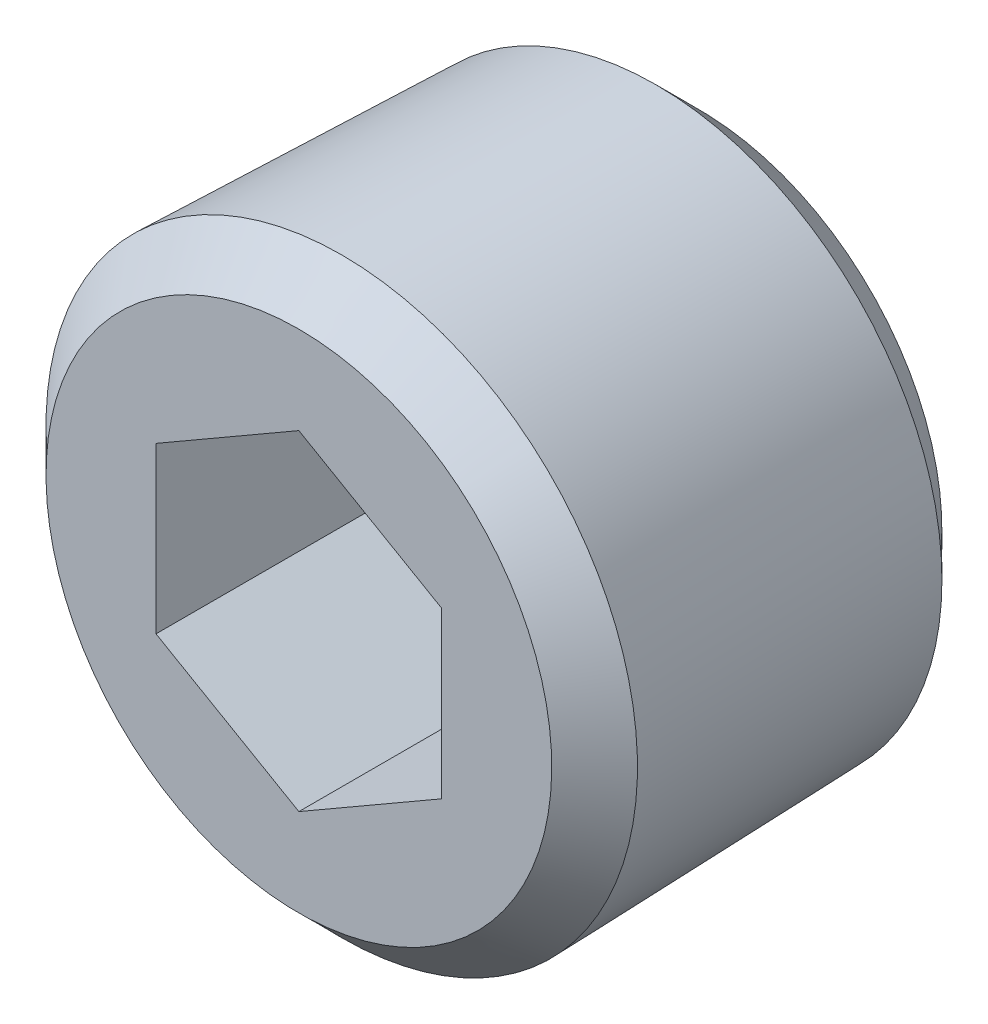
ISO-10303-21;
HEADER;
FILE_DESCRIPTION(('STEP AP214'),'2;1');
FILE_NAME('part.step','',(''),(''),'','','');
FILE_SCHEMA(('AUTOMOTIVE_DESIGN { 1 0 10303 214 1 1 1 1 }'));
ENDSEC;
DATA;
#1=APPLICATION_CONTEXT('core data for automotive mechanical design processes');
#2=APPLICATION_PROTOCOL_DEFINITION('international standard','automotive_design',2000,#1);
#3=PRODUCT_CONTEXT('',#1,'mechanical');
#4=PRODUCT('Part','Part','',(#3));
#5=PRODUCT_RELATED_PRODUCT_CATEGORY('part','',(#4));
#6=PRODUCT_DEFINITION_FORMATION('','',#4);
#7=PRODUCT_DEFINITION_CONTEXT('part definition',#1,'design');
#8=PRODUCT_DEFINITION('design','',#6,#7);
#9=PRODUCT_DEFINITION_SHAPE('','',#8);
#10=(LENGTH_UNIT() NAMED_UNIT(*) SI_UNIT(.MILLI.,.METRE.));
#11=(NAMED_UNIT(*) PLANE_ANGLE_UNIT() SI_UNIT($,.RADIAN.));
#12=(NAMED_UNIT(*) SI_UNIT($,.STERADIAN.) SOLID_ANGLE_UNIT());
#13=UNCERTAINTY_MEASURE_WITH_UNIT(LENGTH_MEASURE(1.E-05),#10,'distance_accuracy_value','');
#14=(GEOMETRIC_REPRESENTATION_CONTEXT(3) GLOBAL_UNCERTAINTY_ASSIGNED_CONTEXT((#13)) GLOBAL_UNIT_ASSIGNED_CONTEXT((#10,
#11,#12)) REPRESENTATION_CONTEXT('',''));
#15=CARTESIAN_POINT('',(0.,0.,0.));
#16=DIRECTION('',(0.,0.,1.));
#17=DIRECTION('',(1.,0.,0.));
#18=AXIS2_PLACEMENT_3D('',#15,#16,#17);
#19=CARTESIAN_POINT('',(0.,8.84999999999991,13.9999999999999));
#20=DIRECTION('',(0.,0.,0.999999999999999));
#21=DIRECTION('',(0.,-1.,0.));
#22=AXIS2_PLACEMENT_3D('',#19,#20,#21);
#23=PLANE('',#22);
#24=DIRECTION('',(0.866025403784439,-0.5,0.));
#25=VECTOR('',#24,1.);
#26=CARTESIAN_POINT('',(-5.00000000000009,-2.8867513459482,14.0000000000002));
#27=LINE('',#26,#25);
#28=CARTESIAN_POINT('',(-5.00000000000009,-2.8867513459482,14.0000000000002));
#29=VERTEX_POINT('',#28);
#30=CARTESIAN_POINT('',(-1.11022302462516E-13,-5.77350269189647,13.9999999999999));
#31=VERTEX_POINT('',#30);
#32=EDGE_CURVE('E57',#29,#31,#27,.T.);
#33=ORIENTED_EDGE('',*,*,#32,.F.);
#34=DIRECTION('',(0.,-1.,0.));
#35=VECTOR('',#34,1.);
#36=CARTESIAN_POINT('',(-5.00000000000011,2.88675134594806,14.));
#37=LINE('',#36,#35);
#38=CARTESIAN_POINT('',(-5.00000000000011,2.88675134594806,14.));
#39=VERTEX_POINT('',#38);
#40=EDGE_CURVE('E140',#39,#29,#37,.T.);
#41=ORIENTED_EDGE('',*,*,#40,.F.);
#42=DIRECTION('',(-0.866025403784437,-0.500000000000001,0.));
#43=VECTOR('',#42,1.);
#44=CARTESIAN_POINT('',(-1.04083408558608E-13,5.77350269189636,14.));
#45=LINE('',#44,#43);
#46=CARTESIAN_POINT('',(-1.04083408558608E-13,5.77350269189636,14.));
#47=VERTEX_POINT('',#46);
#48=EDGE_CURVE('E138',#47,#39,#45,.T.);
#49=ORIENTED_EDGE('',*,*,#48,.F.);
#50=DIRECTION('',(-0.866025403784439,0.5,0.));
#51=VECTOR('',#50,1.);
#52=CARTESIAN_POINT('',(4.99999999999993,2.88675134594805,13.9999999999999));
#53=LINE('',#52,#51);
#54=CARTESIAN_POINT('',(4.99999999999993,2.88675134594805,13.9999999999999));
#55=VERTEX_POINT('',#54);
#56=EDGE_CURVE('E105',#55,#47,#53,.T.);
#57=ORIENTED_EDGE('',*,*,#56,.F.);
#58=DIRECTION('',(0.,1.,0.));
#59=VECTOR('',#58,1.);
#60=CARTESIAN_POINT('',(4.99999999999991,-2.8867513459482,13.9999999999998));
#61=LINE('',#60,#59);
#62=CARTESIAN_POINT('',(4.99999999999991,-2.8867513459482,13.9999999999998));
#63=VERTEX_POINT('',#62);
#64=EDGE_CURVE('E134',#63,#55,#61,.T.);
#65=ORIENTED_EDGE('',*,*,#64,.F.);
#66=DIRECTION('',(0.866025403784436,0.500000000000001,0.));
#67=VECTOR('',#66,1.);
#68=CARTESIAN_POINT('',(-1.11022302462516E-13,-5.77350269189647,13.9999999999999));
#69=LINE('',#68,#67);
#70=EDGE_CURVE('E131',#31,#63,#69,.T.);
#71=ORIENTED_EDGE('',*,*,#70,.F.);
#72=EDGE_LOOP('',(#33,#41,#49,#57,#65,#71));
#73=FACE_BOUND('',#72,.T.);
#74=CARTESIAN_POINT('',(0.,-1.14491749414469E-13,13.9999999999999));
#75=DIRECTION('',(0.,0.,-0.999999999999999));
#76=DIRECTION('',(0.,1.,0.));
#77=AXIS2_PLACEMENT_3D('',#74,#75,#76);
#78=CIRCLE('',#77,8.85);
#79=CARTESIAN_POINT('',(0.,8.85000000000013,13.9999999999999));
#80=VERTEX_POINT('',#79);
#81=EDGE_CURVE('E11',#80,#80,#78,.T.);
#82=ORIENTED_EDGE('',*,*,#81,.F.);
#83=EDGE_LOOP('',(#82));
#84=FACE_BOUND('',#83,.T.);
#85=ADVANCED_FACE('F43',(#73,#84),#23,.T.);
#86=CARTESIAN_POINT('',(0.,0.,12.5));
#87=DIRECTION('',(0.,0.,-0.999999999999999));
#88=DIRECTION('',(0.,1.,0.));
#89=AXIS2_PLACEMENT_3D('',#86,#87,#88);
#90=CONICAL_SURFACE('',#89,10.35,0.785398163397447);
#91=CARTESIAN_POINT('',(0.,0.,12.5));
#92=DIRECTION('',(0.,0.,-0.999999999999999));
#93=DIRECTION('',(0.,1.,0.));
#94=AXIS2_PLACEMENT_3D('',#91,#92,#93);
#95=CIRCLE('',#94,10.35);
#96=CARTESIAN_POINT('',(0.,10.35,12.5));
#97=VERTEX_POINT('',#96);
#98=EDGE_CURVE('E50',#97,#97,#95,.T.);
#99=CARTESIAN_POINT('',(0.,8.85000000000013,13.9999999999999));
#100=CARTESIAN_POINT('',(0.,8.86562500000013,13.9843749999999));
#101=CARTESIAN_POINT('',(0.,8.88125000000013,13.9687499999999));
#102=CARTESIAN_POINT('',(0.,8.91250000000013,13.9374999999999));
#103=CARTESIAN_POINT('',(0.,8.92812500000013,13.9218749999999));
#104=CARTESIAN_POINT('',(0.,8.95937500000012,13.8906249999999));
#105=CARTESIAN_POINT('',(0.,8.97500000000012,13.8749999999999));
#106=CARTESIAN_POINT('',(0.,9.00625000000012,13.8437499999999));
#107=CARTESIAN_POINT('',(0.,9.02187500000012,13.8281249999999));
#108=CARTESIAN_POINT('',(0.,9.05312500000012,13.7968749999999));
#109=CARTESIAN_POINT('',(0.,9.06875000000011,13.7812499999999));
#110=CARTESIAN_POINT('',(0.,9.10000000000011,13.7499999999999));
#111=CARTESIAN_POINT('',(0.,9.11562500000011,13.7343749999999));
#112=CARTESIAN_POINT('',(0.,9.1468750000001,13.7031249999999));
#113=CARTESIAN_POINT('',(0.,9.1625000000001,13.6874999999999));
#114=CARTESIAN_POINT('',(0.,9.1937500000001,13.6562499999999));
#115=CARTESIAN_POINT('',(0.,9.2093750000001,13.6406249999999));
#116=CARTESIAN_POINT('',(0.,9.2406250000001,13.6093749999999));
#117=CARTESIAN_POINT('',(0.,9.2562500000001,13.5937499999999));
#118=CARTESIAN_POINT('',(0.,9.28750000000009,13.5624999999999));
#119=CARTESIAN_POINT('',(0.,9.30312500000009,13.5468749999999));
#120=CARTESIAN_POINT('',(0.,9.33437500000009,13.5156249999999));
#121=CARTESIAN_POINT('',(0.,9.35000000000009,13.4999999999999));
#122=CARTESIAN_POINT('',(0.,9.38125000000008,13.4687499999999));
#123=CARTESIAN_POINT('',(0.,9.39687500000008,13.4531249999999));
#124=CARTESIAN_POINT('',(0.,9.42812500000008,13.4218749999999));
#125=CARTESIAN_POINT('',(0.,9.44375000000008,13.4062499999999));
#126=CARTESIAN_POINT('',(0.,9.47500000000007,13.3749999999999));
#127=CARTESIAN_POINT('',(0.,9.49062500000007,13.3593749999999));
#128=CARTESIAN_POINT('',(0.,9.52187500000007,13.3281249999999));
#129=CARTESIAN_POINT('',(0.,9.53750000000007,13.3124999999999));
#130=CARTESIAN_POINT('',(0.,9.56875000000007,13.2812499999999));
#131=CARTESIAN_POINT('',(0.,9.58437500000007,13.2656249999999));
#132=CARTESIAN_POINT('',(0.,9.61562500000006,13.2343749999999));
#133=CARTESIAN_POINT('',(0.,9.63125000000006,13.2187499999999));
#134=CARTESIAN_POINT('',(0.,9.66250000000006,13.1875));
#135=CARTESIAN_POINT('',(0.,9.67812500000006,13.171875));
#136=CARTESIAN_POINT('',(0.,9.70937500000005,13.140625));
#137=CARTESIAN_POINT('',(0.,9.72500000000005,13.125));
#138=CARTESIAN_POINT('',(0.,9.75625000000005,13.09375));
#139=CARTESIAN_POINT('',(0.,9.77187500000005,13.078125));
#140=CARTESIAN_POINT('',(0.,9.80312500000004,13.046875));
#141=CARTESIAN_POINT('',(0.,9.81875000000004,13.03125));
#142=CARTESIAN_POINT('',(0.,9.85000000000004,13.));
#143=CARTESIAN_POINT('',(0.,9.86562500000004,12.984375));
#144=CARTESIAN_POINT('',(0.,9.89687500000003,12.953125));
#145=CARTESIAN_POINT('',(0.,9.91250000000003,12.9375));
#146=CARTESIAN_POINT('',(0.,9.94375000000003,12.90625));
#147=CARTESIAN_POINT('',(0.,9.95937500000003,12.890625));
#148=CARTESIAN_POINT('',(0.,9.99062500000003,12.859375));
#149=CARTESIAN_POINT('',(0.,10.00625,12.84375));
#150=CARTESIAN_POINT('',(0.,10.0375,12.8125));
#151=CARTESIAN_POINT('',(0.,10.053125,12.796875));
#152=CARTESIAN_POINT('',(0.,10.084375,12.765625));
#153=CARTESIAN_POINT('',(0.,10.1,12.75));
#154=CARTESIAN_POINT('',(0.,10.13125,12.71875));
#155=CARTESIAN_POINT('',(0.,10.146875,12.703125));
#156=CARTESIAN_POINT('',(0.,10.178125,12.671875));
#157=CARTESIAN_POINT('',(0.,10.19375,12.65625));
#158=CARTESIAN_POINT('',(0.,10.225,12.625));
#159=CARTESIAN_POINT('',(0.,10.240625,12.609375));
#160=CARTESIAN_POINT('',(0.,10.271875,12.578125));
#161=CARTESIAN_POINT('',(0.,10.2875,12.5625));
#162=CARTESIAN_POINT('',(0.,10.31875,12.53125));
#163=CARTESIAN_POINT('',(0.,10.334375,12.515625));
#164=CARTESIAN_POINT('',(0.,10.35,12.5));
#165=B_SPLINE_CURVE_WITH_KNOTS('',3,(#99,#100,#101,#102,#103,#104,#105,#106,#107,#108,#109,#110,
#111,#112,#113,#114,#115,#116,#117,#118,#119,#120,#121,#122,#123,#124,#125,#126,#127,#128,#129,
#130,#131,#132,#133,#134,#135,#136,#137,#138,#139,#140,#141,#142,#143,#144,#145,#146,#147,#148,
#149,#150,#151,#152,#153,#154,#155,#156,#157,#158,#159,#160,#161,#162,#163,#164),.UNSPECIFIED.,
.F.,.F.,(4,2,2,2,2,2,2,2,2,2,2,2,2,2,2,2,2,2,2,2,2,2,2,2,2,2,2,2,2,2,2,2,4),(0.,
0.0662912607362328,0.132582521472467,0.198873782208698,0.265165042944931,0.331456303681164,
0.397747564417397,0.464038825153629,0.530330085889861,0.596621346626095,0.662912607362327,
0.72920386809856,0.795495128834792,0.861786389571024,0.928077650307258,0.99436891104349,
1.06066017177972,1.12695143251596,1.19324269325219,1.25953395398842,1.32582521472465,
1.39211647546089,1.45840773619712,1.52469899693335,1.59099025766958,1.65728151840582,
1.72357277914205,1.78986403987828,1.85615530061452,1.92244656135075,1.98873782208698,
2.05502908282321,2.12132034355945),.UNSPECIFIED.);
#166=EDGE_CURVE('BSEAM160',#80,#97,#165,.T.);
#167=ORIENTED_EDGE('',*,*,#81,.T.);
#168=ORIENTED_EDGE('',*,*,#98,.F.);
#169=ORIENTED_EDGE('',*,*,#166,.T.);
#170=ORIENTED_EDGE('',*,*,#166,.F.);
#171=EDGE_LOOP('',(#167,#169,#168,#170));
#172=FACE_BOUND('',#171,.T.);
#173=ADVANCED_FACE('F160',(#172),#90,.T.);
#174=CARTESIAN_POINT('',(0.,0.,1.50000000000011));
#175=DIRECTION('',(0.,0.,0.999999999999999));
#176=DIRECTION('',(0.,-1.,0.));
#177=AXIS2_PLACEMENT_3D('',#174,#175,#176);
#178=CONICAL_SURFACE('',#177,10.0066171682816,0.0312064870256581);
#179=ORIENTED_EDGE('',*,*,#98,.T.);
#180=EDGE_LOOP('',(#179));
#181=FACE_BOUND('',#180,.T.);
#182=CARTESIAN_POINT('',(0.,0.,1.50000000000011));
#183=DIRECTION('',(0.,0.,-0.999999999999999));
#184=DIRECTION('',(0.,1.,0.));
#185=AXIS2_PLACEMENT_3D('',#182,#183,#184);
#186=CIRCLE('',#185,10.0066171682816);
#187=CARTESIAN_POINT('',(0.,-10.0066171682817,1.50000000000011));
#188=VERTEX_POINT('',#187);
#189=EDGE_CURVE('E152',#188,#188,#186,.T.);
#190=ORIENTED_EDGE('',*,*,#189,.F.);
#191=EDGE_LOOP('',(#190));
#192=FACE_BOUND('',#191,.T.);
#193=ADVANCED_FACE('F157',(#181,#192),#178,.T.);
#194=CARTESIAN_POINT('',(0.,0.,0.));
#195=DIRECTION('',(0.,0.,0.999999999999999));
#196=DIRECTION('',(0.,-1.,0.));
#197=AXIS2_PLACEMENT_3D('',#194,#195,#196);
#198=CONICAL_SURFACE('',#197,8.50661716828157,0.785398163397446);
#199=CARTESIAN_POINT('',(0.,0.,0.));
#200=DIRECTION('',(0.,0.,-0.999999999999999));
#201=DIRECTION('',(0.,1.,0.));
#202=AXIS2_PLACEMENT_3D('',#199,#200,#201);
#203=CIRCLE('',#202,8.50661716828157);
#204=CARTESIAN_POINT('',(0.,-8.50661716828157,0.));
#205=VERTEX_POINT('',#204);
#206=EDGE_CURVE('E144',#205,#205,#203,.T.);
#207=CARTESIAN_POINT('',(0.,-10.0066171682817,1.50000000000011));
#208=CARTESIAN_POINT('',(0.,-9.99099216828167,1.48437500000011));
#209=CARTESIAN_POINT('',(0.,-9.97536716828167,1.46875000000011));
#210=CARTESIAN_POINT('',(0.,-9.94411716828167,1.43750000000011));
#211=CARTESIAN_POINT('',(0.,-9.92849216828167,1.4218750000001));
#212=CARTESIAN_POINT('',(0.,-9.89724216828167,1.3906250000001));
#213=CARTESIAN_POINT('',(0.,-9.88161716828167,1.3750000000001));
#214=CARTESIAN_POINT('',(0.,-9.85036716828166,1.3437500000001));
#215=CARTESIAN_POINT('',(0.,-9.83474216828166,1.3281250000001));
#216=CARTESIAN_POINT('',(0.,-9.80349216828166,1.29687500000009));
#217=CARTESIAN_POINT('',(0.,-9.78786716828166,1.28125000000009));
#218=CARTESIAN_POINT('',(0.,-9.75661716828166,1.25000000000009));
#219=CARTESIAN_POINT('',(0.,-9.74099216828166,1.23437500000009));
#220=CARTESIAN_POINT('',(0.,-9.70974216828165,1.20312500000009));
#221=CARTESIAN_POINT('',(0.,-9.69411716828165,1.18750000000009));
#222=CARTESIAN_POINT('',(0.,-9.66286716828165,1.15625000000008));
#223=CARTESIAN_POINT('',(0.,-9.64724216828165,1.14062500000008));
#224=CARTESIAN_POINT('',(0.,-9.61599216828165,1.10937500000008));
#225=CARTESIAN_POINT('',(0.,-9.60036716828165,1.09375000000008));
#226=CARTESIAN_POINT('',(0.,-9.56911716828164,1.06250000000008));
#227=CARTESIAN_POINT('',(0.,-9.55349216828164,1.04687500000008));
#228=CARTESIAN_POINT('',(0.,-9.52224216828164,1.01562500000007));
#229=CARTESIAN_POINT('',(0.,-9.50661716828164,1.00000000000007));
#230=CARTESIAN_POINT('',(0.,-9.47536716828164,0.96875000000007));
#231=CARTESIAN_POINT('',(0.,-9.45974216828164,0.953125000000069));
#232=CARTESIAN_POINT('',(0.,-9.42849216828164,0.921875000000066));
#233=CARTESIAN_POINT('',(0.,-9.41286716828164,0.906250000000065));
#234=CARTESIAN_POINT('',(0.,-9.38161716828163,0.875000000000063));
#235=CARTESIAN_POINT('',(0.,-9.36599216828163,0.859375000000062));
#236=CARTESIAN_POINT('',(0.,-9.33474216828163,0.828125000000059));
#237=CARTESIAN_POINT('',(0.,-9.31911716828163,0.812500000000058));
#238=CARTESIAN_POINT('',(0.,-9.28786716828163,0.781250000000056));
#239=CARTESIAN_POINT('',(0.,-9.27224216828163,0.765625000000055));
#240=CARTESIAN_POINT('',(0.,-9.24099216828162,0.734375000000052));
#241=CARTESIAN_POINT('',(0.,-9.22536716828162,0.718750000000051));
#242=CARTESIAN_POINT('',(0.,-9.19411716828162,0.687500000000049));
#243=CARTESIAN_POINT('',(0.,-9.17849216828162,0.671875000000048));
#244=CARTESIAN_POINT('',(0.,-9.14724216828161,0.640625000000045));
#245=CARTESIAN_POINT('',(0.,-9.13161716828161,0.625000000000044));
#246=CARTESIAN_POINT('',(0.,-9.10036716828161,0.593750000000042));
#247=CARTESIAN_POINT('',(0.,-9.08474216828161,0.578125000000041));
#248=CARTESIAN_POINT('',(0.,-9.05349216828161,0.546875000000038));
#249=CARTESIAN_POINT('',(0.,-9.03786716828161,0.531250000000037));
#250=CARTESIAN_POINT('',(0.,-9.00661716828161,0.500000000000035));
#251=CARTESIAN_POINT('',(0.,-8.9909921682816,0.484375000000033));
#252=CARTESIAN_POINT('',(0.,-8.9597421682816,0.453125000000031));
#253=CARTESIAN_POINT('',(0.,-8.9441171682816,0.43750000000003));
#254=CARTESIAN_POINT('',(0.,-8.9128671682816,0.406250000000028));
#255=CARTESIAN_POINT('',(0.,-8.8972421682816,0.390625000000027));
#256=CARTESIAN_POINT('',(0.,-8.8659921682816,0.359375000000024));
#257=CARTESIAN_POINT('',(0.,-8.8503671682816,0.343750000000023));
#258=CARTESIAN_POINT('',(0.,-8.81911716828159,0.312500000000021));
#259=CARTESIAN_POINT('',(0.,-8.80349216828159,0.29687500000002));
#260=CARTESIAN_POINT('',(0.,-8.77224216828159,0.265625000000017));
#261=CARTESIAN_POINT('',(0.,-8.75661716828159,0.250000000000016));
#262=CARTESIAN_POINT('',(0.,-8.72536716828158,0.218750000000014));
#263=CARTESIAN_POINT('',(0.,-8.70974216828158,0.203125000000013));
#264=CARTESIAN_POINT('',(0.,-8.67849216828158,0.17187500000001));
#265=CARTESIAN_POINT('',(0.,-8.66286716828158,0.156250000000009));
#266=CARTESIAN_POINT('',(0.,-8.63161716828158,0.125000000000007));
#267=CARTESIAN_POINT('',(0.,-8.61599216828158,0.109375000000006));
#268=CARTESIAN_POINT('',(0.,-8.58474216828157,0.0781250000000035));
#269=CARTESIAN_POINT('',(0.,-8.56911716828157,0.0625000000000022));
#270=CARTESIAN_POINT('',(0.,-8.53786716828157,0.0312499999999996));
#271=CARTESIAN_POINT('',(0.,-8.52224216828157,0.0156249999999983));
#272=CARTESIAN_POINT('',(0.,-8.50661716828157,0.));
#273=B_SPLINE_CURVE_WITH_KNOTS('',3,(#207,#208,#209,#210,#211,#212,#213,#214,#215,#216,#217,
#218,#219,#220,#221,#222,#223,#224,#225,#226,#227,#228,#229,#230,#231,#232,#233,#234,#235,#236,
#237,#238,#239,#240,#241,#242,#243,#244,#245,#246,#247,#248,#249,#250,#251,#252,#253,#254,#255,
#256,#257,#258,#259,#260,#261,#262,#263,#264,#265,#266,#267,#268,#269,#270,#271,#272),
.UNSPECIFIED.,.F.,.F.,(4,2,2,2,2,2,2,2,2,2,2,2,2,2,2,2,2,2,2,2,2,2,2,2,2,2,2,2,2,2,2,2,4),(0.,
0.0662912607362438,0.132582521472486,0.19887378220873,0.265165042944974,0.331456303681218,
0.397747564417461,0.464038825153705,0.530330085889949,0.596621346626193,0.662912607362437,
0.729203868098679,0.795495128834923,0.861786389571167,0.928077650307411,0.994368911043654,
1.0606601717799,1.12695143251614,1.19324269325239,1.25953395398863,1.32582521472487,
1.39211647546112,1.45840773619736,1.5246989969336,1.59099025766985,1.65728151840609,
1.72357277914234,1.78986403987858,1.85615530061482,1.92244656135107,1.98873782208731,
2.05502908282355,2.1213203435598),.UNSPECIFIED.);
#274=EDGE_CURVE('BSEAM167',#188,#205,#273,.T.);
#275=ORIENTED_EDGE('',*,*,#189,.T.);
#276=ORIENTED_EDGE('',*,*,#206,.F.);
#277=ORIENTED_EDGE('',*,*,#274,.T.);
#278=ORIENTED_EDGE('',*,*,#274,.F.);
#279=EDGE_LOOP('',(#275,#277,#276,#278));
#280=FACE_BOUND('',#279,.T.);
#281=ADVANCED_FACE('F167',(#280),#198,.T.);
#282=CARTESIAN_POINT('',(0.,0.,0.));
#283=DIRECTION('',(0.,0.,-0.999999999999999));
#284=DIRECTION('',(0.,1.,0.));
#285=AXIS2_PLACEMENT_3D('',#282,#283,#284);
#286=PLANE('',#285);
#287=ORIENTED_EDGE('',*,*,#206,.T.);
#288=EDGE_LOOP('',(#287));
#289=FACE_BOUND('',#288,.T.);
#290=ADVANCED_FACE('F173',(#289),#286,.T.);
#291=CARTESIAN_POINT('',(-5.00000000000012,-2.88675134594828,4.00000000000011));
#292=DIRECTION('',(-0.499999999999998,-0.86602540378444,0.));
#293=DIRECTION('',(0.866025403784439,-0.5,0.));
#294=AXIS2_PLACEMENT_3D('',#291,#292,#293);
#295=PLANE('',#294);
#296=ORIENTED_EDGE('',*,*,#32,.T.);
#297=DIRECTION('',(0.,0.,0.999999999999999));
#298=VECTOR('',#297,1.);
#299=CARTESIAN_POINT('',(0.,-5.77350269189648,3.99999999999992));
#300=LINE('',#299,#298);
#301=CARTESIAN_POINT('',(0.,-5.77350269189648,3.99999999999992));
#302=VERTEX_POINT('',#301);
#303=EDGE_CURVE('E87',#302,#31,#300,.T.);
#304=ORIENTED_EDGE('',*,*,#303,.F.);
#305=DIRECTION('',(0.866025403784439,-0.5,0.));
#306=VECTOR('',#305,1.);
#307=CARTESIAN_POINT('',(-5.00000000000012,-2.88675134594828,4.00000000000011));
#308=LINE('',#307,#306);
#309=CARTESIAN_POINT('',(-5.00000000000012,-2.88675134594828,4.00000000000011));
#310=VERTEX_POINT('',#309);
#311=EDGE_CURVE('E142',#310,#302,#308,.T.);
#312=ORIENTED_EDGE('',*,*,#311,.F.);
#313=DIRECTION('',(0.,0.,0.999999999999999));
#314=VECTOR('',#313,1.);
#315=CARTESIAN_POINT('',(-5.00000000000012,-2.88675134594828,4.00000000000011));
#316=LINE('',#315,#314);
#317=EDGE_CURVE('E65',#310,#29,#316,.T.);
#318=ORIENTED_EDGE('',*,*,#317,.T.);
#319=EDGE_LOOP('',(#296,#304,#312,#318));
#320=FACE_BOUND('',#319,.T.);
#321=ADVANCED_FACE('F177',(#320),#295,.F.);
#322=CARTESIAN_POINT('',(-5.00000000000012,2.88675134594795,4.));
#323=DIRECTION('',(-0.999999999999999,0.,0.));
#324=DIRECTION('',(0.,0.,0.999999999999999));
#325=AXIS2_PLACEMENT_3D('',#322,#323,#324);
#326=PLANE('',#325);
#327=ORIENTED_EDGE('',*,*,#40,.T.);
#328=ORIENTED_EDGE('',*,*,#317,.F.);
#329=DIRECTION('',(0.,-1.,0.));
#330=VECTOR('',#329,1.);
#331=CARTESIAN_POINT('',(-5.00000000000012,2.88675134594795,4.));
#332=LINE('',#331,#330);
#333=CARTESIAN_POINT('',(-5.00000000000012,2.88675134594795,4.));
#334=VERTEX_POINT('',#333);
#335=EDGE_CURVE('E117',#334,#310,#332,.T.);
#336=ORIENTED_EDGE('',*,*,#335,.F.);
#337=DIRECTION('',(0.,0.,0.999999999999999));
#338=VECTOR('',#337,1.);
#339=CARTESIAN_POINT('',(-5.00000000000012,2.88675134594795,4.));
#340=LINE('',#339,#338);
#341=EDGE_CURVE('E109',#334,#39,#340,.T.);
#342=ORIENTED_EDGE('',*,*,#341,.T.);
#343=EDGE_LOOP('',(#327,#328,#336,#342));
#344=FACE_BOUND('',#343,.T.);
#345=ADVANCED_FACE('F181',(#344),#326,.F.);
#346=CARTESIAN_POINT('',(0.,5.77350269189625,4.00000000000017));
#347=DIRECTION('',(-0.500000000000002,0.866025403784438,0.));
#348=DIRECTION('',(-0.866025403784437,-0.500000000000002,0.));
#349=AXIS2_PLACEMENT_3D('',#346,#347,#348);
#350=PLANE('',#349);
#351=ORIENTED_EDGE('',*,*,#48,.T.);
#352=ORIENTED_EDGE('',*,*,#341,.F.);
#353=DIRECTION('',(-0.866025403784437,-0.500000000000001,0.));
#354=VECTOR('',#353,1.);
#355=CARTESIAN_POINT('',(0.,5.77350269189625,4.00000000000017));
#356=LINE('',#355,#354);
#357=CARTESIAN_POINT('',(0.,5.77350269189625,4.00000000000017));
#358=VERTEX_POINT('',#357);
#359=EDGE_CURVE('E113',#358,#334,#356,.T.);
#360=ORIENTED_EDGE('',*,*,#359,.F.);
#361=DIRECTION('',(0.,0.,0.999999999999999));
#362=VECTOR('',#361,1.);
#363=CARTESIAN_POINT('',(0.,5.77350269189625,4.00000000000017));
#364=LINE('',#363,#362);
#365=EDGE_CURVE('E98',#358,#47,#364,.T.);
#366=ORIENTED_EDGE('',*,*,#365,.T.);
#367=EDGE_LOOP('',(#351,#352,#360,#366));
#368=FACE_BOUND('',#367,.T.);
#369=ADVANCED_FACE('F114',(#368),#350,.F.);
#370=CARTESIAN_POINT('',(5.,2.88675134594805,4.00000000000006));
#371=DIRECTION('',(0.499999999999997,0.86602540378444,0.));
#372=DIRECTION('',(-0.866025403784439,0.5,0.));
#373=AXIS2_PLACEMENT_3D('',#370,#371,#372);
#374=PLANE('',#373);
#375=ORIENTED_EDGE('',*,*,#56,.T.);
#376=ORIENTED_EDGE('',*,*,#365,.F.);
#377=DIRECTION('',(-0.866025403784439,0.5,0.));
#378=VECTOR('',#377,1.);
#379=CARTESIAN_POINT('',(5.,2.88675134594805,4.00000000000006));
#380=LINE('',#379,#378);
#381=CARTESIAN_POINT('',(5.,2.88675134594805,4.00000000000006));
#382=VERTEX_POINT('',#381);
#383=EDGE_CURVE('E102',#382,#358,#380,.T.);
#384=ORIENTED_EDGE('',*,*,#383,.F.);
#385=DIRECTION('',(0.,0.,0.999999999999999));
#386=VECTOR('',#385,1.);
#387=CARTESIAN_POINT('',(5.,2.88675134594805,4.00000000000006));
#388=LINE('',#387,#386);
#389=EDGE_CURVE('E110',#382,#55,#388,.T.);
#390=ORIENTED_EDGE('',*,*,#389,.T.);
#391=EDGE_LOOP('',(#375,#376,#384,#390));
#392=FACE_BOUND('',#391,.T.);
#393=ADVANCED_FACE('F100',(#392),#374,.F.);
#394=CARTESIAN_POINT('',(5.00000000000013,-2.88675134594818,4.00000000000011));
#395=DIRECTION('',(0.999999999999999,0.,0.));
#396=DIRECTION('',(0.,1.,0.));
#397=AXIS2_PLACEMENT_3D('',#394,#395,#396);
#398=PLANE('',#397);
#399=ORIENTED_EDGE('',*,*,#64,.T.);
#400=ORIENTED_EDGE('',*,*,#389,.F.);
#401=DIRECTION('',(0.,1.,0.));
#402=VECTOR('',#401,1.);
#403=CARTESIAN_POINT('',(5.00000000000013,-2.88675134594818,4.00000000000011));
#404=LINE('',#403,#402);
#405=CARTESIAN_POINT('',(5.00000000000013,-2.88675134594818,4.00000000000011));
#406=VERTEX_POINT('',#405);
#407=EDGE_CURVE('E123',#406,#382,#404,.T.);
#408=ORIENTED_EDGE('',*,*,#407,.F.);
#409=DIRECTION('',(0.,0.,0.999999999999999));
#410=VECTOR('',#409,1.);
#411=CARTESIAN_POINT('',(5.00000000000013,-2.88675134594818,4.00000000000011));
#412=LINE('',#411,#410);
#413=EDGE_CURVE('E147',#406,#63,#412,.T.);
#414=ORIENTED_EDGE('',*,*,#413,.T.);
#415=EDGE_LOOP('',(#399,#400,#408,#414));
#416=FACE_BOUND('',#415,.T.);
#417=ADVANCED_FACE('F185',(#416),#398,.F.);
#418=CARTESIAN_POINT('',(0.,-5.77350269189648,3.99999999999992));
#419=DIRECTION('',(0.500000000000002,-0.866025403784438,0.));
#420=DIRECTION('',(0.866025403784437,0.500000000000002,0.));
#421=AXIS2_PLACEMENT_3D('',#418,#419,#420);
#422=PLANE('',#421);
#423=ORIENTED_EDGE('',*,*,#70,.T.);
#424=ORIENTED_EDGE('',*,*,#413,.F.);
#425=DIRECTION('',(0.866025403784436,0.500000000000001,0.));
#426=VECTOR('',#425,1.);
#427=CARTESIAN_POINT('',(0.,-5.77350269189648,3.99999999999992));
#428=LINE('',#427,#426);
#429=EDGE_CURVE('E125',#302,#406,#428,.T.);
#430=ORIENTED_EDGE('',*,*,#429,.F.);
#431=ORIENTED_EDGE('',*,*,#303,.T.);
#432=EDGE_LOOP('',(#423,#424,#430,#431));
#433=FACE_BOUND('',#432,.T.);
#434=ADVANCED_FACE('F182',(#433),#422,.F.);
#435=CARTESIAN_POINT('',(-10.0000000000001,0.,4.));
#436=DIRECTION('',(0.,0.,-0.999999999999999));
#437=DIRECTION('',(-0.999999999999999,0.,0.));
#438=AXIS2_PLACEMENT_3D('',#435,#436,#437);
#439=PLANE('',#438);
#440=ORIENTED_EDGE('',*,*,#311,.T.);
#441=ORIENTED_EDGE('',*,*,#429,.T.);
#442=ORIENTED_EDGE('',*,*,#407,.T.);
#443=ORIENTED_EDGE('',*,*,#383,.T.);
#444=ORIENTED_EDGE('',*,*,#359,.T.);
#445=ORIENTED_EDGE('',*,*,#335,.T.);
#446=EDGE_LOOP('',(#440,#441,#442,#443,#444,#445));
#447=FACE_BOUND('',#446,.T.);
#448=ADVANCED_FACE('F120',(#447),#439,.F.);
#449=CLOSED_SHELL('',(#85,#173,#193,#281,#290,#321,#345,#369,#393,#417,#434,#448));
#450=MANIFOLD_SOLID_BREP('B2',#449);
#451=ADVANCED_BREP_SHAPE_REPRESENTATION('',(#18,#450),#14);
#452=SHAPE_DEFINITION_REPRESENTATION(#9,#451);
ENDSEC;
END-ISO-10303-21;
